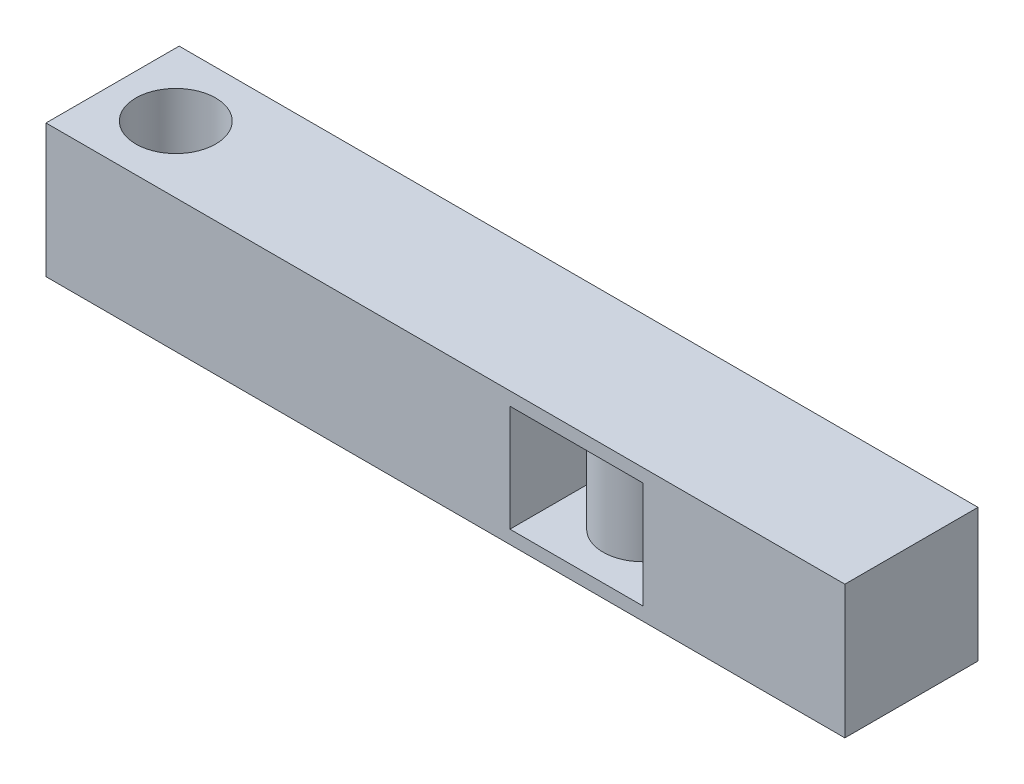
ISO-10303-21;
HEADER;
FILE_DESCRIPTION(('STEP AP214'),'2;1');
FILE_NAME('part.step','',(''),(''),'','','');
FILE_SCHEMA(('AUTOMOTIVE_DESIGN { 1 0 10303 214 1 1 1 1 }'));
ENDSEC;
DATA;
#1=APPLICATION_CONTEXT('core data for automotive mechanical design processes');
#2=APPLICATION_PROTOCOL_DEFINITION('international standard','automotive_design',2000,#1);
#3=PRODUCT_CONTEXT('',#1,'mechanical');
#4=PRODUCT('Part','Part','',(#3));
#5=PRODUCT_RELATED_PRODUCT_CATEGORY('part','',(#4));
#6=PRODUCT_DEFINITION_FORMATION('','',#4);
#7=PRODUCT_DEFINITION_CONTEXT('part definition',#1,'design');
#8=PRODUCT_DEFINITION('design','',#6,#7);
#9=PRODUCT_DEFINITION_SHAPE('','',#8);
#10=(LENGTH_UNIT() NAMED_UNIT(*) SI_UNIT(.MILLI.,.METRE.));
#11=(NAMED_UNIT(*) PLANE_ANGLE_UNIT() SI_UNIT($,.RADIAN.));
#12=(NAMED_UNIT(*) SI_UNIT($,.STERADIAN.) SOLID_ANGLE_UNIT());
#13=UNCERTAINTY_MEASURE_WITH_UNIT(LENGTH_MEASURE(1.E-05),#10,'distance_accuracy_value','');
#14=(GEOMETRIC_REPRESENTATION_CONTEXT(3) GLOBAL_UNCERTAINTY_ASSIGNED_CONTEXT((#13)) GLOBAL_UNIT_ASSIGNED_CONTEXT((#10,
#11,#12)) REPRESENTATION_CONTEXT('',''));
#15=CARTESIAN_POINT('',(0.,0.,0.));
#16=DIRECTION('',(0.,0.,1.));
#17=DIRECTION('',(1.,0.,0.));
#18=AXIS2_PLACEMENT_3D('',#15,#16,#17);
#19=CARTESIAN_POINT('',(0.,0.,50.));
#20=DIRECTION('',(0.,0.,1.));
#21=DIRECTION('',(1.,0.,0.));
#22=AXIS2_PLACEMENT_3D('',#19,#20,#21);
#23=PLANE('',#22);
#24=DIRECTION('',(0.,1.,0.));
#25=VECTOR('',#24,1.);
#26=CARTESIAN_POINT('',(150.,25.,50.));
#27=LINE('',#26,#25);
#28=CARTESIAN_POINT('',(150.,-25.,50.));
#29=VERTEX_POINT('',#28);
#30=CARTESIAN_POINT('',(150.,25.,50.));
#31=VERTEX_POINT('',#30);
#32=EDGE_CURVE('E163',#29,#31,#27,.T.);
#33=ORIENTED_EDGE('',*,*,#32,.T.);
#34=DIRECTION('',(-1.,0.,0.));
#35=VECTOR('',#34,1.);
#36=CARTESIAN_POINT('',(-150.,25.,50.));
#37=LINE('',#36,#35);
#38=CARTESIAN_POINT('',(-150.,25.,50.));
#39=VERTEX_POINT('',#38);
#40=EDGE_CURVE('E166',#31,#39,#37,.T.);
#41=ORIENTED_EDGE('',*,*,#40,.T.);
#42=DIRECTION('',(0.,-1.,0.));
#43=VECTOR('',#42,1.);
#44=CARTESIAN_POINT('',(-150.,25.,50.));
#45=LINE('',#44,#43);
#46=CARTESIAN_POINT('',(-150.,-25.,50.));
#47=VERTEX_POINT('',#46);
#48=EDGE_CURVE('E169',#39,#47,#45,.T.);
#49=ORIENTED_EDGE('',*,*,#48,.T.);
#50=DIRECTION('',(1.,0.,0.));
#51=VECTOR('',#50,1.);
#52=CARTESIAN_POINT('',(-150.,-25.,50.));
#53=LINE('',#52,#51);
#54=EDGE_CURVE('E171',#47,#29,#53,.T.);
#55=ORIENTED_EDGE('',*,*,#54,.T.);
#56=EDGE_LOOP('',(#33,#41,#49,#55));
#57=FACE_BOUND('',#56,.T.);
#58=DIRECTION('',(0.,1.,0.));
#59=VECTOR('',#58,1.);
#60=CARTESIAN_POINT('',(74.2339215808115,-20.,50.));
#61=LINE('',#60,#59);
#62=CARTESIAN_POINT('',(74.2339215808115,-20.,50.));
#63=VERTEX_POINT('',#62);
#64=CARTESIAN_POINT('',(74.2339215808115,20.,50.));
#65=VERTEX_POINT('',#64);
#66=EDGE_CURVE('E150',#63,#65,#61,.T.);
#67=ORIENTED_EDGE('',*,*,#66,.F.);
#68=DIRECTION('',(1.,0.,0.));
#69=VECTOR('',#68,1.);
#70=CARTESIAN_POINT('',(24.2339215808115,-20.,50.));
#71=LINE('',#70,#69);
#72=CARTESIAN_POINT('',(24.2339215808115,-20.,50.));
#73=VERTEX_POINT('',#72);
#74=EDGE_CURVE('E124',#73,#63,#71,.T.);
#75=ORIENTED_EDGE('',*,*,#74,.F.);
#76=DIRECTION('',(0.,1.,0.));
#77=VECTOR('',#76,1.);
#78=CARTESIAN_POINT('',(24.2339215808115,-20.,50.));
#79=LINE('',#78,#77);
#80=CARTESIAN_POINT('',(24.2339215808115,20.,50.));
#81=VERTEX_POINT('',#80);
#82=EDGE_CURVE('E153',#73,#81,#79,.T.);
#83=ORIENTED_EDGE('',*,*,#82,.T.);
#84=DIRECTION('',(1.,0.,0.));
#85=VECTOR('',#84,1.);
#86=CARTESIAN_POINT('',(24.2339215808115,20.,50.));
#87=LINE('',#86,#85);
#88=EDGE_CURVE('E134',#81,#65,#87,.T.);
#89=ORIENTED_EDGE('',*,*,#88,.T.);
#90=EDGE_LOOP('',(#67,#75,#83,#89));
#91=FACE_BOUND('',#90,.T.);
#92=ADVANCED_FACE('F52',(#57,#91),#23,.T.);
#93=CARTESIAN_POINT('',(0.,0.,0.));
#94=DIRECTION('',(0.,0.,1.));
#95=DIRECTION('',(1.,0.,0.));
#96=AXIS2_PLACEMENT_3D('',#93,#94,#95);
#97=PLANE('',#96);
#98=DIRECTION('',(0.,1.,0.));
#99=VECTOR('',#98,1.);
#100=CARTESIAN_POINT('',(150.,25.,0.));
#101=LINE('',#100,#99);
#102=CARTESIAN_POINT('',(150.,-25.,0.));
#103=VERTEX_POINT('',#102);
#104=CARTESIAN_POINT('',(150.,25.,0.));
#105=VERTEX_POINT('',#104);
#106=EDGE_CURVE('E162',#103,#105,#101,.T.);
#107=ORIENTED_EDGE('',*,*,#106,.F.);
#108=DIRECTION('',(1.,0.,0.));
#109=VECTOR('',#108,1.);
#110=CARTESIAN_POINT('',(-150.,-25.,0.));
#111=LINE('',#110,#109);
#112=CARTESIAN_POINT('',(-150.,-25.,0.));
#113=VERTEX_POINT('',#112);
#114=EDGE_CURVE('E167',#113,#103,#111,.T.);
#115=ORIENTED_EDGE('',*,*,#114,.F.);
#116=DIRECTION('',(0.,-1.,0.));
#117=VECTOR('',#116,1.);
#118=CARTESIAN_POINT('',(-150.,25.,0.));
#119=LINE('',#118,#117);
#120=CARTESIAN_POINT('',(-150.,25.,0.));
#121=VERTEX_POINT('',#120);
#122=EDGE_CURVE('E178',#121,#113,#119,.T.);
#123=ORIENTED_EDGE('',*,*,#122,.F.);
#124=DIRECTION('',(-1.,0.,0.));
#125=VECTOR('',#124,1.);
#126=CARTESIAN_POINT('',(-150.,25.,0.));
#127=LINE('',#126,#125);
#128=EDGE_CURVE('E176',#105,#121,#127,.T.);
#129=ORIENTED_EDGE('',*,*,#128,.F.);
#130=EDGE_LOOP('',(#107,#115,#123,#129));
#131=FACE_BOUND('',#130,.T.);
#132=DIRECTION('',(-1.,0.,0.));
#133=VECTOR('',#132,1.);
#134=CARTESIAN_POINT('',(24.2339215808115,-20.,0.));
#135=LINE('',#134,#133);
#136=CARTESIAN_POINT('',(74.2339215808115,-20.,0.));
#137=VERTEX_POINT('',#136);
#138=CARTESIAN_POINT('',(24.2339215808115,-20.,0.));
#139=VERTEX_POINT('',#138);
#140=EDGE_CURVE('E130',#137,#139,#135,.T.);
#141=ORIENTED_EDGE('',*,*,#140,.F.);
#142=DIRECTION('',(0.,1.,0.));
#143=VECTOR('',#142,1.);
#144=CARTESIAN_POINT('',(74.2339215808115,-20.,0.));
#145=LINE('',#144,#143);
#146=CARTESIAN_POINT('',(74.2339215808115,20.,0.));
#147=VERTEX_POINT('',#146);
#148=EDGE_CURVE('E115',#137,#147,#145,.T.);
#149=ORIENTED_EDGE('',*,*,#148,.T.);
#150=DIRECTION('',(-1.,0.,0.));
#151=VECTOR('',#150,1.);
#152=CARTESIAN_POINT('',(24.2339215808115,20.,0.));
#153=LINE('',#152,#151);
#154=CARTESIAN_POINT('',(24.2339215808115,20.,0.));
#155=VERTEX_POINT('',#154);
#156=EDGE_CURVE('E144',#147,#155,#153,.T.);
#157=ORIENTED_EDGE('',*,*,#156,.T.);
#158=DIRECTION('',(0.,1.,0.));
#159=VECTOR('',#158,1.);
#160=CARTESIAN_POINT('',(24.2339215808115,-20.,0.));
#161=LINE('',#160,#159);
#162=EDGE_CURVE('E123',#139,#155,#161,.T.);
#163=ORIENTED_EDGE('',*,*,#162,.F.);
#164=EDGE_LOOP('',(#141,#149,#157,#163));
#165=FACE_BOUND('',#164,.T.);
#166=ADVANCED_FACE('F136',(#131,#165),#97,.F.);
#167=CARTESIAN_POINT('',(150.,25.,50.));
#168=DIRECTION('',(-1.,0.,0.));
#169=DIRECTION('',(0.,0.,1.));
#170=AXIS2_PLACEMENT_3D('',#167,#168,#169);
#171=PLANE('',#170);
#172=ORIENTED_EDGE('',*,*,#106,.T.);
#173=DIRECTION('',(0.,0.,-1.));
#174=VECTOR('',#173,1.);
#175=CARTESIAN_POINT('',(150.,25.,50.));
#176=LINE('',#175,#174);
#177=EDGE_CURVE('E60',#31,#105,#176,.T.);
#178=ORIENTED_EDGE('',*,*,#177,.F.);
#179=ORIENTED_EDGE('',*,*,#32,.F.);
#180=DIRECTION('',(0.,0.,-1.));
#181=VECTOR('',#180,1.);
#182=CARTESIAN_POINT('',(150.,-25.,50.));
#183=LINE('',#182,#181);
#184=EDGE_CURVE('E173',#29,#103,#183,.T.);
#185=ORIENTED_EDGE('',*,*,#184,.T.);
#186=EDGE_LOOP('',(#172,#178,#179,#185));
#187=FACE_BOUND('',#186,.T.);
#188=ADVANCED_FACE('F54',(#187),#171,.F.);
#189=CARTESIAN_POINT('',(-150.,25.,50.));
#190=DIRECTION('',(0.,-1.,0.));
#191=DIRECTION('',(0.,0.,-1.));
#192=AXIS2_PLACEMENT_3D('',#189,#190,#191);
#193=PLANE('',#192);
#194=CARTESIAN_POINT('',(-126.266078419189,25.,25.));
#195=DIRECTION('',(0.,-1.,0.));
#196=DIRECTION('',(0.,0.,-1.));
#197=AXIS2_PLACEMENT_3D('',#194,#195,#196);
#198=CIRCLE('',#197,15.);
#199=CARTESIAN_POINT('',(-126.266078419189,25.,10.));
#200=VERTEX_POINT('',#199);
#201=EDGE_CURVE('E159',#200,#200,#198,.T.);
#202=ORIENTED_EDGE('',*,*,#201,.T.);
#203=EDGE_LOOP('',(#202));
#204=FACE_BOUND('',#203,.T.);
#205=ORIENTED_EDGE('',*,*,#128,.T.);
#206=DIRECTION('',(0.,0.,-1.));
#207=VECTOR('',#206,1.);
#208=CARTESIAN_POINT('',(-150.,25.,50.));
#209=LINE('',#208,#207);
#210=EDGE_CURVE('E186',#39,#121,#209,.T.);
#211=ORIENTED_EDGE('',*,*,#210,.F.);
#212=ORIENTED_EDGE('',*,*,#40,.F.);
#213=ORIENTED_EDGE('',*,*,#177,.T.);
#214=EDGE_LOOP('',(#205,#211,#212,#213));
#215=FACE_BOUND('',#214,.T.);
#216=ADVANCED_FACE('F191',(#204,#215),#193,.F.);
#217=CARTESIAN_POINT('',(-150.,25.,50.));
#218=DIRECTION('',(1.,0.,0.));
#219=DIRECTION('',(0.,0.,-1.));
#220=AXIS2_PLACEMENT_3D('',#217,#218,#219);
#221=PLANE('',#220);
#222=ORIENTED_EDGE('',*,*,#122,.T.);
#223=DIRECTION('',(0.,0.,-1.));
#224=VECTOR('',#223,1.);
#225=CARTESIAN_POINT('',(-150.,-25.,50.));
#226=LINE('',#225,#224);
#227=EDGE_CURVE('E183',#47,#113,#226,.T.);
#228=ORIENTED_EDGE('',*,*,#227,.F.);
#229=ORIENTED_EDGE('',*,*,#48,.F.);
#230=ORIENTED_EDGE('',*,*,#210,.T.);
#231=EDGE_LOOP('',(#222,#228,#229,#230));
#232=FACE_BOUND('',#231,.T.);
#233=ADVANCED_FACE('F202',(#232),#221,.F.);
#234=CARTESIAN_POINT('',(-150.,-25.,50.));
#235=DIRECTION('',(0.,1.,0.));
#236=DIRECTION('',(0.,0.,1.));
#237=AXIS2_PLACEMENT_3D('',#234,#235,#236);
#238=PLANE('',#237);
#239=CARTESIAN_POINT('',(-126.266078419189,-25.,25.));
#240=DIRECTION('',(0.,1.,0.));
#241=DIRECTION('',(0.,0.,1.));
#242=AXIS2_PLACEMENT_3D('',#239,#240,#241);
#243=CIRCLE('',#242,15.);
#244=CARTESIAN_POINT('',(-126.266078419189,-25.,40.));
#245=VERTEX_POINT('',#244);
#246=EDGE_CURVE('E152',#245,#245,#243,.T.);
#247=ORIENTED_EDGE('',*,*,#246,.T.);
#248=EDGE_LOOP('',(#247));
#249=FACE_BOUND('',#248,.T.);
#250=ORIENTED_EDGE('',*,*,#114,.T.);
#251=ORIENTED_EDGE('',*,*,#184,.F.);
#252=ORIENTED_EDGE('',*,*,#54,.F.);
#253=ORIENTED_EDGE('',*,*,#227,.T.);
#254=EDGE_LOOP('',(#250,#251,#252,#253));
#255=FACE_BOUND('',#254,.T.);
#256=ADVANCED_FACE('F206',(#249,#255),#238,.F.);
#257=CARTESIAN_POINT('',(-126.266078419189,-25.,25.));
#258=DIRECTION('',(0.,1.,0.));
#259=DIRECTION('',(0.,0.,1.));
#260=AXIS2_PLACEMENT_3D('',#257,#258,#259);
#261=CYLINDRICAL_SURFACE('',#260,15.);
#262=ORIENTED_EDGE('',*,*,#246,.F.);
#263=EDGE_LOOP('',(#262));
#264=FACE_BOUND('',#263,.T.);
#265=ORIENTED_EDGE('',*,*,#201,.F.);
#266=EDGE_LOOP('',(#265));
#267=FACE_BOUND('',#266,.T.);
#268=ADVANCED_FACE('F232',(#264,#267),#261,.F.);
#269=CARTESIAN_POINT('',(74.2339215808115,-20.,0.));
#270=DIRECTION('',(1.,0.,0.));
#271=DIRECTION('',(0.,0.,-1.));
#272=AXIS2_PLACEMENT_3D('',#269,#270,#271);
#273=PLANE('',#272);
#274=DIRECTION('',(0.,0.,-1.));
#275=VECTOR('',#274,1.);
#276=CARTESIAN_POINT('',(74.2339215808115,20.,0.));
#277=LINE('',#276,#275);
#278=EDGE_CURVE('E67',#65,#147,#277,.T.);
#279=ORIENTED_EDGE('',*,*,#278,.T.);
#280=ORIENTED_EDGE('',*,*,#148,.F.);
#281=DIRECTION('',(0.,0.,-1.));
#282=VECTOR('',#281,1.);
#283=CARTESIAN_POINT('',(74.2339215808115,-20.,0.));
#284=LINE('',#283,#282);
#285=EDGE_CURVE('E118',#63,#137,#284,.T.);
#286=ORIENTED_EDGE('',*,*,#285,.F.);
#287=ORIENTED_EDGE('',*,*,#66,.T.);
#288=EDGE_LOOP('',(#279,#280,#286,#287));
#289=FACE_BOUND('',#288,.T.);
#290=ADVANCED_FACE('F117',(#289),#273,.F.);
#291=CARTESIAN_POINT('',(24.2339215808115,-20.,0.));
#292=DIRECTION('',(-1.,0.,0.));
#293=DIRECTION('',(0.,0.,1.));
#294=AXIS2_PLACEMENT_3D('',#291,#292,#293);
#295=PLANE('',#294);
#296=DIRECTION('',(0.,0.,1.));
#297=VECTOR('',#296,1.);
#298=CARTESIAN_POINT('',(24.2339215808115,20.,0.));
#299=LINE('',#298,#297);
#300=EDGE_CURVE('E72',#155,#81,#299,.T.);
#301=ORIENTED_EDGE('',*,*,#300,.T.);
#302=ORIENTED_EDGE('',*,*,#82,.F.);
#303=DIRECTION('',(0.,0.,1.));
#304=VECTOR('',#303,1.);
#305=CARTESIAN_POINT('',(24.2339215808115,-20.,0.));
#306=LINE('',#305,#304);
#307=EDGE_CURVE('E137',#139,#73,#306,.T.);
#308=ORIENTED_EDGE('',*,*,#307,.F.);
#309=ORIENTED_EDGE('',*,*,#162,.T.);
#310=EDGE_LOOP('',(#301,#302,#308,#309));
#311=FACE_BOUND('',#310,.T.);
#312=ADVANCED_FACE('F222',(#311),#295,.F.);
#313=CARTESIAN_POINT('',(0.,-20.,0.));
#314=DIRECTION('',(0.,1.,0.));
#315=DIRECTION('',(0.,0.,1.));
#316=AXIS2_PLACEMENT_3D('',#313,#314,#315);
#317=PLANE('',#316);
#318=CARTESIAN_POINT('',(49.2339215808115,-20.,25.));
#319=DIRECTION('',(0.,1.,0.));
#320=DIRECTION('',(0.,0.,1.));
#321=AXIS2_PLACEMENT_3D('',#318,#319,#320);
#322=CIRCLE('',#321,15.);
#323=CARTESIAN_POINT('',(49.2339215808115,-20.,10.));
#324=VERTEX_POINT('',#323);
#325=EDGE_CURVE('E145',#324,#324,#322,.T.);
#326=ORIENTED_EDGE('',*,*,#325,.F.);
#327=EDGE_LOOP('',(#326));
#328=FACE_BOUND('',#327,.T.);
#329=ORIENTED_EDGE('',*,*,#285,.T.);
#330=ORIENTED_EDGE('',*,*,#140,.T.);
#331=ORIENTED_EDGE('',*,*,#307,.T.);
#332=ORIENTED_EDGE('',*,*,#74,.T.);
#333=EDGE_LOOP('',(#329,#330,#331,#332));
#334=FACE_BOUND('',#333,.T.);
#335=ADVANCED_FACE('F128',(#328,#334),#317,.T.);
#336=CARTESIAN_POINT('',(0.,20.,0.));
#337=DIRECTION('',(0.,1.,0.));
#338=DIRECTION('',(0.,0.,1.));
#339=AXIS2_PLACEMENT_3D('',#336,#337,#338);
#340=PLANE('',#339);
#341=CARTESIAN_POINT('',(49.2339215808115,20.,25.));
#342=DIRECTION('',(0.,1.,0.));
#343=DIRECTION('',(0.,0.,1.));
#344=AXIS2_PLACEMENT_3D('',#341,#342,#343);
#345=CIRCLE('',#344,15.);
#346=CARTESIAN_POINT('',(49.2339215808115,20.,10.));
#347=VERTEX_POINT('',#346);
#348=EDGE_CURVE('E13',#347,#347,#345,.F.);
#349=ORIENTED_EDGE('',*,*,#348,.F.);
#350=EDGE_LOOP('',(#349));
#351=FACE_BOUND('',#350,.T.);
#352=ORIENTED_EDGE('',*,*,#278,.F.);
#353=ORIENTED_EDGE('',*,*,#88,.F.);
#354=ORIENTED_EDGE('',*,*,#300,.F.);
#355=ORIENTED_EDGE('',*,*,#156,.F.);
#356=EDGE_LOOP('',(#352,#353,#354,#355));
#357=FACE_BOUND('',#356,.T.);
#358=ADVANCED_FACE('F211',(#351,#357),#340,.F.);
#359=CARTESIAN_POINT('',(49.2339215808115,25.002,25.));
#360=DIRECTION('',(0.,-1.,0.));
#361=DIRECTION('',(0.,0.,-1.));
#362=AXIS2_PLACEMENT_3D('',#359,#360,#361);
#363=CYLINDRICAL_SURFACE('',#362,15.);
#364=CARTESIAN_POINT('',(49.2339215808115,-20.,10.));
#365=CARTESIAN_POINT('',(49.2339215808115,-19.5833333333333,10.));
#366=CARTESIAN_POINT('',(49.2339215808115,-19.1666666666667,10.));
#367=CARTESIAN_POINT('',(49.2339215808115,-18.3333333333333,10.));
#368=CARTESIAN_POINT('',(49.2339215808115,-17.9166666666667,10.));
#369=CARTESIAN_POINT('',(49.2339215808115,-17.0833333333333,10.));
#370=CARTESIAN_POINT('',(49.2339215808115,-16.6666666666667,10.));
#371=CARTESIAN_POINT('',(49.2339215808115,-15.8333333333333,10.));
#372=CARTESIAN_POINT('',(49.2339215808115,-15.4166666666667,10.));
#373=CARTESIAN_POINT('',(49.2339215808115,-14.5833333333333,10.));
#374=CARTESIAN_POINT('',(49.2339215808115,-14.1666666666667,10.));
#375=CARTESIAN_POINT('',(49.2339215808115,-13.3333333333333,10.));
#376=CARTESIAN_POINT('',(49.2339215808115,-12.9166666666667,10.));
#377=CARTESIAN_POINT('',(49.2339215808115,-12.0833333333333,10.));
#378=CARTESIAN_POINT('',(49.2339215808115,-11.6666666666667,10.));
#379=CARTESIAN_POINT('',(49.2339215808115,-10.8333333333333,10.));
#380=CARTESIAN_POINT('',(49.2339215808115,-10.4166666666667,10.));
#381=CARTESIAN_POINT('',(49.2339215808115,-9.58333333333334,10.));
#382=CARTESIAN_POINT('',(49.2339215808115,-9.16666666666667,10.));
#383=CARTESIAN_POINT('',(49.2339215808115,-8.33333333333334,10.));
#384=CARTESIAN_POINT('',(49.2339215808115,-7.91666666666667,10.));
#385=CARTESIAN_POINT('',(49.2339215808115,-7.08333333333334,10.));
#386=CARTESIAN_POINT('',(49.2339215808115,-6.66666666666667,10.));
#387=CARTESIAN_POINT('',(49.2339215808115,-5.83333333333334,10.));
#388=CARTESIAN_POINT('',(49.2339215808115,-5.41666666666667,10.));
#389=CARTESIAN_POINT('',(49.2339215808115,-4.58333333333334,10.));
#390=CARTESIAN_POINT('',(49.2339215808115,-4.16666666666667,10.));
#391=CARTESIAN_POINT('',(49.2339215808115,-3.33333333333334,10.));
#392=CARTESIAN_POINT('',(49.2339215808115,-2.91666666666667,10.));
#393=CARTESIAN_POINT('',(49.2339215808115,-2.08333333333334,10.));
#394=CARTESIAN_POINT('',(49.2339215808115,-1.66666666666667,10.));
#395=CARTESIAN_POINT('',(49.2339215808115,-0.833333333333338,10.));
#396=CARTESIAN_POINT('',(49.2339215808115,-0.416666666666671,10.));
#397=CARTESIAN_POINT('',(49.2339215808115,0.416666666666664,10.));
#398=CARTESIAN_POINT('',(49.2339215808115,0.833333333333331,10.));
#399=CARTESIAN_POINT('',(49.2339215808115,1.66666666666666,10.));
#400=CARTESIAN_POINT('',(49.2339215808115,2.08333333333333,10.));
#401=CARTESIAN_POINT('',(49.2339215808115,2.91666666666666,10.));
#402=CARTESIAN_POINT('',(49.2339215808115,3.33333333333333,10.));
#403=CARTESIAN_POINT('',(49.2339215808115,4.16666666666666,10.));
#404=CARTESIAN_POINT('',(49.2339215808115,4.58333333333333,10.));
#405=CARTESIAN_POINT('',(49.2339215808115,5.41666666666666,10.));
#406=CARTESIAN_POINT('',(49.2339215808115,5.83333333333333,10.));
#407=CARTESIAN_POINT('',(49.2339215808115,6.66666666666667,10.));
#408=CARTESIAN_POINT('',(49.2339215808115,7.08333333333333,10.));
#409=CARTESIAN_POINT('',(49.2339215808115,7.91666666666667,10.));
#410=CARTESIAN_POINT('',(49.2339215808115,8.33333333333333,10.));
#411=CARTESIAN_POINT('',(49.2339215808115,9.16666666666667,10.));
#412=CARTESIAN_POINT('',(49.2339215808115,9.58333333333333,10.));
#413=CARTESIAN_POINT('',(49.2339215808115,10.4166666666667,10.));
#414=CARTESIAN_POINT('',(49.2339215808115,10.8333333333333,10.));
#415=CARTESIAN_POINT('',(49.2339215808115,11.6666666666667,10.));
#416=CARTESIAN_POINT('',(49.2339215808115,12.0833333333333,10.));
#417=CARTESIAN_POINT('',(49.2339215808115,12.9166666666667,10.));
#418=CARTESIAN_POINT('',(49.2339215808115,13.3333333333333,10.));
#419=CARTESIAN_POINT('',(49.2339215808115,14.1666666666667,10.));
#420=CARTESIAN_POINT('',(49.2339215808115,14.5833333333333,10.));
#421=CARTESIAN_POINT('',(49.2339215808115,15.4166666666667,10.));
#422=CARTESIAN_POINT('',(49.2339215808115,15.8333333333333,10.));
#423=CARTESIAN_POINT('',(49.2339215808115,16.6666666666667,10.));
#424=CARTESIAN_POINT('',(49.2339215808115,17.0833333333333,10.));
#425=CARTESIAN_POINT('',(49.2339215808115,17.9166666666667,10.));
#426=CARTESIAN_POINT('',(49.2339215808115,18.3333333333333,10.));
#427=CARTESIAN_POINT('',(49.2339215808115,19.1666666666667,10.));
#428=CARTESIAN_POINT('',(49.2339215808115,19.5833333333333,10.));
#429=CARTESIAN_POINT('',(49.2339215808115,20.,10.));
#430=B_SPLINE_CURVE_WITH_KNOTS('',3,(#364,#365,#366,#367,#368,#369,#370,#371,#372,#373,#374,
#375,#376,#377,#378,#379,#380,#381,#382,#383,#384,#385,#386,#387,#388,#389,#390,#391,#392,#393,
#394,#395,#396,#397,#398,#399,#400,#401,#402,#403,#404,#405,#406,#407,#408,#409,#410,#411,#412,
#413,#414,#415,#416,#417,#418,#419,#420,#421,#422,#423,#424,#425,#426,#427,#428,#429),
.UNSPECIFIED.,.F.,.F.,(4,2,2,2,2,2,2,2,2,2,2,2,2,2,2,2,2,2,2,2,2,2,2,2,2,2,2,2,2,2,2,2,4),(0.,
1.25,2.5,3.75,5.,6.25000000000001,7.50000000000001,8.75,10.,11.25,12.5,13.75,15.,16.25,17.5,
18.75,20.,21.25,22.5,23.75,25.,26.25,27.5,28.75,30.,31.25,32.5,33.75,35.,36.25,37.5,38.75,40.),.UNSPECIFIED.);
#431=EDGE_CURVE('BSEAM213',#324,#347,#430,.T.);
#432=ORIENTED_EDGE('',*,*,#325,.T.);
#433=ORIENTED_EDGE('',*,*,#348,.T.);
#434=ORIENTED_EDGE('',*,*,#431,.T.);
#435=ORIENTED_EDGE('',*,*,#431,.F.);
#436=EDGE_LOOP('',(#432,#434,#433,#435));
#437=FACE_BOUND('',#436,.T.);
#438=ADVANCED_FACE('F213',(#437),#363,.T.);
#439=CLOSED_SHELL('',(#92,#166,#188,#216,#233,#256,#268,#290,#312,#335,#358,#438));
#440=MANIFOLD_SOLID_BREP('B2',#439);
#441=ADVANCED_BREP_SHAPE_REPRESENTATION('',(#18,#440),#14);
#442=SHAPE_DEFINITION_REPRESENTATION(#9,#441);
ENDSEC;
END-ISO-10303-21;
